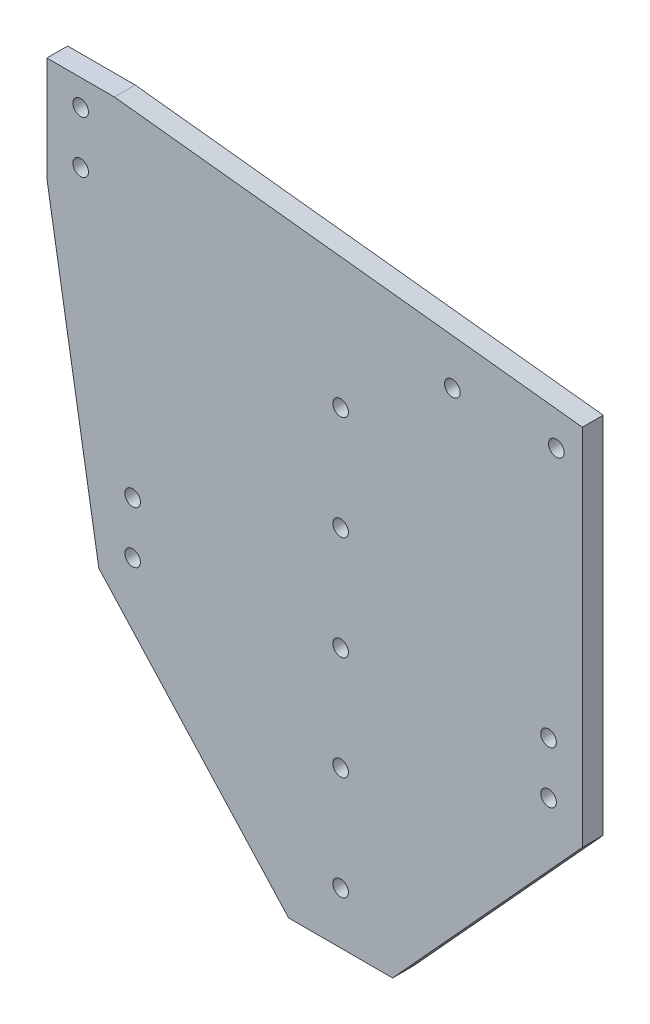
ISO-10303-21;
HEADER;
FILE_DESCRIPTION(('STEP AP214'),'2;1');
FILE_NAME('part.step','',(''),(''),'','','');
FILE_SCHEMA(('AUTOMOTIVE_DESIGN { 1 0 10303 214 1 1 1 1 }'));
ENDSEC;
DATA;
#1=APPLICATION_CONTEXT('core data for automotive mechanical design processes');
#2=APPLICATION_PROTOCOL_DEFINITION('international standard','automotive_design',2000,#1);
#3=PRODUCT_CONTEXT('',#1,'mechanical');
#4=PRODUCT('Part','Part','',(#3));
#5=PRODUCT_RELATED_PRODUCT_CATEGORY('part','',(#4));
#6=PRODUCT_DEFINITION_FORMATION('','',#4);
#7=PRODUCT_DEFINITION_CONTEXT('part definition',#1,'design');
#8=PRODUCT_DEFINITION('design','',#6,#7);
#9=PRODUCT_DEFINITION_SHAPE('','',#8);
#10=(LENGTH_UNIT() NAMED_UNIT(*) SI_UNIT(.MILLI.,.METRE.));
#11=(NAMED_UNIT(*) PLANE_ANGLE_UNIT() SI_UNIT($,.RADIAN.));
#12=(NAMED_UNIT(*) SI_UNIT($,.STERADIAN.) SOLID_ANGLE_UNIT());
#13=UNCERTAINTY_MEASURE_WITH_UNIT(LENGTH_MEASURE(1.E-05),#10,'distance_accuracy_value','');
#14=(GEOMETRIC_REPRESENTATION_CONTEXT(3) GLOBAL_UNCERTAINTY_ASSIGNED_CONTEXT((#13)) GLOBAL_UNIT_ASSIGNED_CONTEXT((#10,
#11,#12)) REPRESENTATION_CONTEXT('',''));
#15=CARTESIAN_POINT('',(0.,0.,0.));
#16=DIRECTION('',(0.,0.,1.));
#17=DIRECTION('',(1.,0.,0.));
#18=AXIS2_PLACEMENT_3D('',#15,#16,#17);
#19=CARTESIAN_POINT('',(0.,0.,4.));
#20=DIRECTION('',(0.,0.,-1.));
#21=DIRECTION('',(-1.,0.,0.));
#22=AXIS2_PLACEMENT_3D('',#19,#20,#21);
#23=PLANE('',#22);
#24=DIRECTION('',(0.674050394139193,0.738685363440212,0.));
#25=VECTOR('',#24,1.);
#26=CARTESIAN_POINT('',(-36.5,-40.,4.));
#27=LINE('',#26,#25);
#28=CARTESIAN_POINT('',(-36.5,-40.,4.));
#29=VERTEX_POINT('',#28);
#30=CARTESIAN_POINT('',(0.,0.,4.));
#31=VERTEX_POINT('',#30);
#32=EDGE_CURVE('E153',#29,#31,#27,.T.);
#33=ORIENTED_EDGE('',*,*,#32,.T.);
#34=DIRECTION('',(0.,1.,0.));
#35=VECTOR('',#34,1.);
#36=CARTESIAN_POINT('',(0.,0.,4.));
#37=LINE('',#36,#35);
#38=CARTESIAN_POINT('',(0.,70.,4.));
#39=VERTEX_POINT('',#38);
#40=EDGE_CURVE('E101',#31,#39,#37,.T.);
#41=ORIENTED_EDGE('',*,*,#40,.T.);
#42=DIRECTION('',(-0.993883734673619,0.110431526074847,0.));
#43=VECTOR('',#42,1.);
#44=CARTESIAN_POINT('',(-90.,80.,4.));
#45=LINE('',#44,#43);
#46=CARTESIAN_POINT('',(-90.,80.,4.));
#47=VERTEX_POINT('',#46);
#48=EDGE_CURVE('E169',#39,#47,#45,.T.);
#49=ORIENTED_EDGE('',*,*,#48,.T.);
#50=DIRECTION('',(-1.,0.,0.));
#51=VECTOR('',#50,1.);
#52=CARTESIAN_POINT('',(-103.,80.,4.));
#53=LINE('',#52,#51);
#54=CARTESIAN_POINT('',(-103.,80.,4.));
#55=VERTEX_POINT('',#54);
#56=EDGE_CURVE('E182',#47,#55,#53,.T.);
#57=ORIENTED_EDGE('',*,*,#56,.T.);
#58=DIRECTION('',(0.,-1.,0.));
#59=VECTOR('',#58,1.);
#60=CARTESIAN_POINT('',(-103.,80.,4.));
#61=LINE('',#60,#59);
#62=CARTESIAN_POINT('',(-103.,60.,4.));
#63=VERTEX_POINT('',#62);
#64=EDGE_CURVE('E119',#55,#63,#61,.T.);
#65=ORIENTED_EDGE('',*,*,#64,.T.);
#66=DIRECTION('',(0.164398987305357,-0.986393923832144,0.));
#67=VECTOR('',#66,1.);
#68=CARTESIAN_POINT('',(-103.,60.,4.));
#69=LINE('',#68,#67);
#70=CARTESIAN_POINT('',(-93.,0.,4.));
#71=VERTEX_POINT('',#70);
#72=EDGE_CURVE('E111',#63,#71,#69,.T.);
#73=ORIENTED_EDGE('',*,*,#72,.T.);
#74=DIRECTION('',(0.674050394139193,-0.738685363440212,0.));
#75=VECTOR('',#74,1.);
#76=CARTESIAN_POINT('',(-93.,0.,4.));
#77=LINE('',#76,#75);
#78=CARTESIAN_POINT('',(-56.5,-40.,4.));
#79=VERTEX_POINT('',#78);
#80=EDGE_CURVE('E116',#71,#79,#77,.T.);
#81=ORIENTED_EDGE('',*,*,#80,.T.);
#82=DIRECTION('',(1.,0.,0.));
#83=VECTOR('',#82,1.);
#84=CARTESIAN_POINT('',(-56.5,-40.,4.));
#85=LINE('',#84,#83);
#86=EDGE_CURVE('E59',#79,#29,#85,.T.);
#87=ORIENTED_EDGE('',*,*,#86,.T.);
#88=EDGE_LOOP('',(#33,#41,#49,#57,#65,#73,#81,#87));
#89=FACE_BOUND('',#88,.T.);
#90=CARTESIAN_POINT('',(-86.5,15.,4.));
#91=DIRECTION('',(0.,0.,1.));
#92=DIRECTION('',(1.,0.,0.));
#93=AXIS2_PLACEMENT_3D('',#90,#91,#92);
#94=CIRCLE('',#93,1.5);
#95=CARTESIAN_POINT('',(-85.,15.,4.));
#96=VERTEX_POINT('',#95);
#97=EDGE_CURVE('E142',#96,#96,#94,.T.);
#98=ORIENTED_EDGE('',*,*,#97,.F.);
#99=EDGE_LOOP('',(#98));
#100=FACE_BOUND('',#99,.T.);
#101=CARTESIAN_POINT('',(-86.5,5.,4.));
#102=DIRECTION('',(0.,0.,1.));
#103=DIRECTION('',(-1.,0.,0.));
#104=AXIS2_PLACEMENT_3D('',#101,#102,#103);
#105=CIRCLE('',#104,1.5);
#106=CARTESIAN_POINT('',(-88.,5.,4.));
#107=VERTEX_POINT('',#106);
#108=EDGE_CURVE('E189',#107,#107,#105,.T.);
#109=ORIENTED_EDGE('',*,*,#108,.F.);
#110=EDGE_LOOP('',(#109));
#111=FACE_BOUND('',#110,.T.);
#112=CARTESIAN_POINT('',(-6.5,5.,4.));
#113=DIRECTION('',(0.,0.,1.));
#114=DIRECTION('',(1.,0.,0.));
#115=AXIS2_PLACEMENT_3D('',#112,#113,#114);
#116=CIRCLE('',#115,1.5);
#117=CARTESIAN_POINT('',(-5.,5.,4.));
#118=VERTEX_POINT('',#117);
#119=EDGE_CURVE('E198',#118,#118,#116,.T.);
#120=ORIENTED_EDGE('',*,*,#119,.F.);
#121=EDGE_LOOP('',(#120));
#122=FACE_BOUND('',#121,.T.);
#123=CARTESIAN_POINT('',(-6.50000000000001,15.,4.));
#124=DIRECTION('',(0.,0.,1.));
#125=DIRECTION('',(-1.,0.,0.));
#126=AXIS2_PLACEMENT_3D('',#123,#124,#125);
#127=CIRCLE('',#126,1.5);
#128=CARTESIAN_POINT('',(-8.00000000000001,15.,4.));
#129=VERTEX_POINT('',#128);
#130=EDGE_CURVE('E205',#129,#129,#127,.T.);
#131=ORIENTED_EDGE('',*,*,#130,.F.);
#132=EDGE_LOOP('',(#131));
#133=FACE_BOUND('',#132,.T.);
#134=CARTESIAN_POINT('',(-96.5,75.,4.));
#135=DIRECTION('',(0.,0.,1.));
#136=DIRECTION('',(1.,0.,0.));
#137=AXIS2_PLACEMENT_3D('',#134,#135,#136);
#138=CIRCLE('',#137,1.5);
#139=CARTESIAN_POINT('',(-95.,75.,4.));
#140=VERTEX_POINT('',#139);
#141=EDGE_CURVE('E208',#140,#140,#138,.T.);
#142=ORIENTED_EDGE('',*,*,#141,.F.);
#143=EDGE_LOOP('',(#142));
#144=FACE_BOUND('',#143,.T.);
#145=CARTESIAN_POINT('',(-96.4999999999999,65.,4.));
#146=DIRECTION('',(0.,0.,1.));
#147=DIRECTION('',(1.,0.,0.));
#148=AXIS2_PLACEMENT_3D('',#145,#146,#147);
#149=CIRCLE('',#148,1.5);
#150=CARTESIAN_POINT('',(-94.9999999999999,65.,4.));
#151=VERTEX_POINT('',#150);
#152=EDGE_CURVE('E212',#151,#151,#149,.T.);
#153=ORIENTED_EDGE('',*,*,#152,.F.);
#154=EDGE_LOOP('',(#153));
#155=FACE_BOUND('',#154,.T.);
#156=CARTESIAN_POINT('',(-46.5,9.99999999999999,4.));
#157=DIRECTION('',(0.,0.,1.));
#158=DIRECTION('',(1.,0.,0.));
#159=AXIS2_PLACEMENT_3D('',#156,#157,#158);
#160=CIRCLE('',#159,1.5);
#161=CARTESIAN_POINT('',(-45.,9.99999999999999,4.));
#162=VERTEX_POINT('',#161);
#163=EDGE_CURVE('E219',#162,#162,#160,.T.);
#164=ORIENTED_EDGE('',*,*,#163,.F.);
#165=EDGE_LOOP('',(#164));
#166=FACE_BOUND('',#165,.T.);
#167=CARTESIAN_POINT('',(-46.5000000000001,30.,4.));
#168=DIRECTION('',(0.,0.,1.));
#169=DIRECTION('',(1.,0.,0.));
#170=AXIS2_PLACEMENT_3D('',#167,#168,#169);
#171=CIRCLE('',#170,1.5);
#172=CARTESIAN_POINT('',(-45.0000000000001,30.,4.));
#173=VERTEX_POINT('',#172);
#174=EDGE_CURVE('E228',#173,#173,#171,.T.);
#175=ORIENTED_EDGE('',*,*,#174,.F.);
#176=EDGE_LOOP('',(#175));
#177=FACE_BOUND('',#176,.T.);
#178=CARTESIAN_POINT('',(-46.5000000000001,50.,4.));
#179=DIRECTION('',(0.,0.,1.));
#180=DIRECTION('',(1.,0.,0.));
#181=AXIS2_PLACEMENT_3D('',#178,#179,#180);
#182=CIRCLE('',#181,1.5);
#183=CARTESIAN_POINT('',(-45.0000000000001,50.,4.));
#184=VERTEX_POINT('',#183);
#185=EDGE_CURVE('E235',#184,#184,#182,.T.);
#186=ORIENTED_EDGE('',*,*,#185,.F.);
#187=EDGE_LOOP('',(#186));
#188=FACE_BOUND('',#187,.T.);
#189=CARTESIAN_POINT('',(-46.4999999999998,-10.,4.));
#190=DIRECTION('',(0.,0.,1.));
#191=DIRECTION('',(1.,0.,0.));
#192=AXIS2_PLACEMENT_3D('',#189,#190,#191);
#193=CIRCLE('',#192,1.5);
#194=CARTESIAN_POINT('',(-44.9999999999998,-10.,4.));
#195=VERTEX_POINT('',#194);
#196=EDGE_CURVE('E236',#195,#195,#193,.T.);
#197=ORIENTED_EDGE('',*,*,#196,.F.);
#198=EDGE_LOOP('',(#197));
#199=FACE_BOUND('',#198,.T.);
#200=CARTESIAN_POINT('',(-46.4999999999996,-30.,4.));
#201=DIRECTION('',(0.,0.,1.));
#202=DIRECTION('',(1.,0.,0.));
#203=AXIS2_PLACEMENT_3D('',#200,#201,#202);
#204=CIRCLE('',#203,1.5);
#205=CARTESIAN_POINT('',(-44.9999999999996,-30.,4.));
#206=VERTEX_POINT('',#205);
#207=EDGE_CURVE('E242',#206,#206,#204,.T.);
#208=ORIENTED_EDGE('',*,*,#207,.F.);
#209=EDGE_LOOP('',(#208));
#210=FACE_BOUND('',#209,.T.);
#211=CARTESIAN_POINT('',(-5.,64.,4.));
#212=DIRECTION('',(0.,0.,1.));
#213=DIRECTION('',(1.,0.,0.));
#214=AXIS2_PLACEMENT_3D('',#211,#212,#213);
#215=CIRCLE('',#214,1.5);
#216=CARTESIAN_POINT('',(-3.5,64.,4.));
#217=VERTEX_POINT('',#216);
#218=EDGE_CURVE('E249',#217,#217,#215,.T.);
#219=ORIENTED_EDGE('',*,*,#218,.F.);
#220=EDGE_LOOP('',(#219));
#221=FACE_BOUND('',#220,.T.);
#222=CARTESIAN_POINT('',(-25.,64.,4.));
#223=DIRECTION('',(0.,0.,1.));
#224=DIRECTION('',(1.,0.,0.));
#225=AXIS2_PLACEMENT_3D('',#222,#223,#224);
#226=CIRCLE('',#225,1.5);
#227=CARTESIAN_POINT('',(-23.5,64.,4.));
#228=VERTEX_POINT('',#227);
#229=EDGE_CURVE('E258',#228,#228,#226,.T.);
#230=ORIENTED_EDGE('',*,*,#229,.F.);
#231=EDGE_LOOP('',(#230));
#232=FACE_BOUND('',#231,.T.);
#233=ADVANCED_FACE('F41',(#89,#100,#111,#122,#133,#144,#155,#166,#177,#188,#199,#210,#221,#232),
#23,.F.);
#234=CARTESIAN_POINT('',(0.,0.,0.));
#235=DIRECTION('',(0.,0.,-1.));
#236=DIRECTION('',(-1.,0.,0.));
#237=AXIS2_PLACEMENT_3D('',#234,#235,#236);
#238=PLANE('',#237);
#239=CARTESIAN_POINT('',(-5.,64.,0.));
#240=DIRECTION('',(0.,0.,1.));
#241=DIRECTION('',(1.,0.,0.));
#242=AXIS2_PLACEMENT_3D('',#239,#240,#241);
#243=CIRCLE('',#242,1.5);
#244=CARTESIAN_POINT('',(-3.5,64.,0.));
#245=VERTEX_POINT('',#244);
#246=EDGE_CURVE('E251',#245,#245,#243,.T.);
#247=ORIENTED_EDGE('',*,*,#246,.T.);
#248=EDGE_LOOP('',(#247));
#249=FACE_BOUND('',#248,.T.);
#250=CARTESIAN_POINT('',(-46.4999999999998,-10.,0.));
#251=DIRECTION('',(0.,0.,1.));
#252=DIRECTION('',(1.,0.,0.));
#253=AXIS2_PLACEMENT_3D('',#250,#251,#252);
#254=CIRCLE('',#253,1.5);
#255=CARTESIAN_POINT('',(-44.9999999999998,-10.,0.));
#256=VERTEX_POINT('',#255);
#257=EDGE_CURVE('E243',#256,#256,#254,.T.);
#258=ORIENTED_EDGE('',*,*,#257,.T.);
#259=EDGE_LOOP('',(#258));
#260=FACE_BOUND('',#259,.T.);
#261=CARTESIAN_POINT('',(-46.5000000000001,30.,0.));
#262=DIRECTION('',(0.,0.,1.));
#263=DIRECTION('',(1.,0.,0.));
#264=AXIS2_PLACEMENT_3D('',#261,#262,#263);
#265=CIRCLE('',#264,1.5);
#266=CARTESIAN_POINT('',(-45.0000000000001,30.,0.));
#267=VERTEX_POINT('',#266);
#268=EDGE_CURVE('E227',#267,#267,#265,.T.);
#269=ORIENTED_EDGE('',*,*,#268,.T.);
#270=EDGE_LOOP('',(#269));
#271=FACE_BOUND('',#270,.T.);
#272=CARTESIAN_POINT('',(-96.4999999999999,65.,0.));
#273=DIRECTION('',(0.,0.,1.));
#274=DIRECTION('',(1.,0.,0.));
#275=AXIS2_PLACEMENT_3D('',#272,#273,#274);
#276=CIRCLE('',#275,1.5);
#277=CARTESIAN_POINT('',(-94.9999999999999,65.,0.));
#278=VERTEX_POINT('',#277);
#279=EDGE_CURVE('E220',#278,#278,#276,.T.);
#280=ORIENTED_EDGE('',*,*,#279,.T.);
#281=EDGE_LOOP('',(#280));
#282=FACE_BOUND('',#281,.T.);
#283=CARTESIAN_POINT('',(-6.50000000000001,15.,0.));
#284=DIRECTION('',(0.,0.,1.));
#285=DIRECTION('',(-1.,0.,0.));
#286=AXIS2_PLACEMENT_3D('',#283,#284,#285);
#287=CIRCLE('',#286,1.5);
#288=CARTESIAN_POINT('',(-8.00000000000001,15.,0.));
#289=VERTEX_POINT('',#288);
#290=EDGE_CURVE('E202',#289,#289,#287,.T.);
#291=ORIENTED_EDGE('',*,*,#290,.T.);
#292=EDGE_LOOP('',(#291));
#293=FACE_BOUND('',#292,.T.);
#294=CARTESIAN_POINT('',(-86.5,5.,0.));
#295=DIRECTION('',(0.,0.,1.));
#296=DIRECTION('',(-1.,0.,0.));
#297=AXIS2_PLACEMENT_3D('',#294,#295,#296);
#298=CIRCLE('',#297,1.5);
#299=CARTESIAN_POINT('',(-88.,5.,0.));
#300=VERTEX_POINT('',#299);
#301=EDGE_CURVE('E191',#300,#300,#298,.T.);
#302=ORIENTED_EDGE('',*,*,#301,.T.);
#303=EDGE_LOOP('',(#302));
#304=FACE_BOUND('',#303,.T.);
#305=DIRECTION('',(0.674050394139193,0.738685363440212,0.));
#306=VECTOR('',#305,1.);
#307=CARTESIAN_POINT('',(-36.5,-40.,0.));
#308=LINE('',#307,#306);
#309=CARTESIAN_POINT('',(-36.5,-40.,0.));
#310=VERTEX_POINT('',#309);
#311=CARTESIAN_POINT('',(0.,0.,0.));
#312=VERTEX_POINT('',#311);
#313=EDGE_CURVE('E136',#310,#312,#308,.T.);
#314=ORIENTED_EDGE('',*,*,#313,.F.);
#315=DIRECTION('',(1.,0.,0.));
#316=VECTOR('',#315,1.);
#317=CARTESIAN_POINT('',(-56.5,-40.,0.));
#318=LINE('',#317,#316);
#319=CARTESIAN_POINT('',(-56.5,-40.,0.));
#320=VERTEX_POINT('',#319);
#321=EDGE_CURVE('E91',#320,#310,#318,.T.);
#322=ORIENTED_EDGE('',*,*,#321,.F.);
#323=DIRECTION('',(0.674050394139193,-0.738685363440212,0.));
#324=VECTOR('',#323,1.);
#325=CARTESIAN_POINT('',(-93.,0.,0.));
#326=LINE('',#325,#324);
#327=CARTESIAN_POINT('',(-93.,0.,0.));
#328=VERTEX_POINT('',#327);
#329=EDGE_CURVE('E87',#328,#320,#326,.T.);
#330=ORIENTED_EDGE('',*,*,#329,.F.);
#331=DIRECTION('',(0.164398987305357,-0.986393923832144,0.));
#332=VECTOR('',#331,1.);
#333=CARTESIAN_POINT('',(-103.,60.,0.));
#334=LINE('',#333,#332);
#335=CARTESIAN_POINT('',(-103.,60.,0.));
#336=VERTEX_POINT('',#335);
#337=EDGE_CURVE('E126',#336,#328,#334,.T.);
#338=ORIENTED_EDGE('',*,*,#337,.F.);
#339=DIRECTION('',(0.,-1.,0.));
#340=VECTOR('',#339,1.);
#341=CARTESIAN_POINT('',(-103.,80.,0.));
#342=LINE('',#341,#340);
#343=CARTESIAN_POINT('',(-103.,80.,0.));
#344=VERTEX_POINT('',#343);
#345=EDGE_CURVE('E146',#344,#336,#342,.T.);
#346=ORIENTED_EDGE('',*,*,#345,.F.);
#347=DIRECTION('',(-1.,0.,0.));
#348=VECTOR('',#347,1.);
#349=CARTESIAN_POINT('',(-103.,80.,0.));
#350=LINE('',#349,#348);
#351=CARTESIAN_POINT('',(-90.,80.,0.));
#352=VERTEX_POINT('',#351);
#353=EDGE_CURVE('E148',#352,#344,#350,.T.);
#354=ORIENTED_EDGE('',*,*,#353,.F.);
#355=DIRECTION('',(-0.993883734673619,0.110431526074847,0.));
#356=VECTOR('',#355,1.);
#357=CARTESIAN_POINT('',(-90.,80.,0.));
#358=LINE('',#357,#356);
#359=CARTESIAN_POINT('',(0.,70.,0.));
#360=VERTEX_POINT('',#359);
#361=EDGE_CURVE('E145',#360,#352,#358,.T.);
#362=ORIENTED_EDGE('',*,*,#361,.F.);
#363=DIRECTION('',(0.,1.,0.));
#364=VECTOR('',#363,1.);
#365=CARTESIAN_POINT('',(0.,0.,0.));
#366=LINE('',#365,#364);
#367=EDGE_CURVE('E143',#312,#360,#366,.T.);
#368=ORIENTED_EDGE('',*,*,#367,.F.);
#369=EDGE_LOOP('',(#314,#322,#330,#338,#346,#354,#362,#368));
#370=FACE_BOUND('',#369,.T.);
#371=CARTESIAN_POINT('',(-86.5,15.,0.));
#372=DIRECTION('',(0.,0.,1.));
#373=DIRECTION('',(1.,0.,0.));
#374=AXIS2_PLACEMENT_3D('',#371,#372,#373);
#375=CIRCLE('',#374,1.5);
#376=CARTESIAN_POINT('',(-85.,15.,0.));
#377=VERTEX_POINT('',#376);
#378=EDGE_CURVE('E190',#377,#377,#375,.T.);
#379=ORIENTED_EDGE('',*,*,#378,.T.);
#380=EDGE_LOOP('',(#379));
#381=FACE_BOUND('',#380,.T.);
#382=CARTESIAN_POINT('',(-6.5,5.,0.));
#383=DIRECTION('',(0.,0.,1.));
#384=DIRECTION('',(1.,0.,0.));
#385=AXIS2_PLACEMENT_3D('',#382,#383,#384);
#386=CIRCLE('',#385,1.5);
#387=CARTESIAN_POINT('',(-5.,5.,0.));
#388=VERTEX_POINT('',#387);
#389=EDGE_CURVE('E200',#388,#388,#386,.T.);
#390=ORIENTED_EDGE('',*,*,#389,.T.);
#391=EDGE_LOOP('',(#390));
#392=FACE_BOUND('',#391,.T.);
#393=CARTESIAN_POINT('',(-96.5,75.,0.));
#394=DIRECTION('',(0.,0.,1.));
#395=DIRECTION('',(1.,0.,0.));
#396=AXIS2_PLACEMENT_3D('',#393,#394,#395);
#397=CIRCLE('',#396,1.5);
#398=CARTESIAN_POINT('',(-95.,75.,0.));
#399=VERTEX_POINT('',#398);
#400=EDGE_CURVE('E211',#399,#399,#397,.T.);
#401=ORIENTED_EDGE('',*,*,#400,.T.);
#402=EDGE_LOOP('',(#401));
#403=FACE_BOUND('',#402,.T.);
#404=CARTESIAN_POINT('',(-46.5,9.99999999999999,0.));
#405=DIRECTION('',(0.,0.,1.));
#406=DIRECTION('',(1.,0.,0.));
#407=AXIS2_PLACEMENT_3D('',#404,#405,#406);
#408=CIRCLE('',#407,1.5);
#409=CARTESIAN_POINT('',(-45.,9.99999999999999,0.));
#410=VERTEX_POINT('',#409);
#411=EDGE_CURVE('E224',#410,#410,#408,.T.);
#412=ORIENTED_EDGE('',*,*,#411,.T.);
#413=EDGE_LOOP('',(#412));
#414=FACE_BOUND('',#413,.T.);
#415=CARTESIAN_POINT('',(-46.5000000000001,50.,0.));
#416=DIRECTION('',(0.,0.,1.));
#417=DIRECTION('',(1.,0.,0.));
#418=AXIS2_PLACEMENT_3D('',#415,#416,#417);
#419=CIRCLE('',#418,1.5);
#420=CARTESIAN_POINT('',(-45.0000000000001,50.,0.));
#421=VERTEX_POINT('',#420);
#422=EDGE_CURVE('E234',#421,#421,#419,.T.);
#423=ORIENTED_EDGE('',*,*,#422,.T.);
#424=EDGE_LOOP('',(#423));
#425=FACE_BOUND('',#424,.T.);
#426=CARTESIAN_POINT('',(-46.4999999999996,-30.,0.));
#427=DIRECTION('',(0.,0.,1.));
#428=DIRECTION('',(1.,0.,0.));
#429=AXIS2_PLACEMENT_3D('',#426,#427,#428);
#430=CIRCLE('',#429,1.5);
#431=CARTESIAN_POINT('',(-44.9999999999996,-30.,0.));
#432=VERTEX_POINT('',#431);
#433=EDGE_CURVE('E250',#432,#432,#430,.T.);
#434=ORIENTED_EDGE('',*,*,#433,.T.);
#435=EDGE_LOOP('',(#434));
#436=FACE_BOUND('',#435,.T.);
#437=CARTESIAN_POINT('',(-25.,64.,0.));
#438=DIRECTION('',(0.,0.,1.));
#439=DIRECTION('',(1.,0.,0.));
#440=AXIS2_PLACEMENT_3D('',#437,#438,#439);
#441=CIRCLE('',#440,1.5);
#442=CARTESIAN_POINT('',(-23.5,64.,0.));
#443=VERTEX_POINT('',#442);
#444=EDGE_CURVE('E259',#443,#443,#441,.T.);
#445=ORIENTED_EDGE('',*,*,#444,.T.);
#446=EDGE_LOOP('',(#445));
#447=FACE_BOUND('',#446,.T.);
#448=ADVANCED_FACE('F175',(#249,#260,#271,#282,#293,#304,#370,#381,#392,#403,#414,#425,#436,
#447),#238,.T.);
#449=CARTESIAN_POINT('',(-36.5,-40.,4.));
#450=DIRECTION('',(-0.738685363440212,0.674050394139193,0.));
#451=DIRECTION('',(-0.674050394139193,-0.738685363440212,0.));
#452=AXIS2_PLACEMENT_3D('',#449,#450,#451);
#453=PLANE('',#452);
#454=ORIENTED_EDGE('',*,*,#313,.T.);
#455=DIRECTION('',(0.,0.,-1.));
#456=VECTOR('',#455,1.);
#457=CARTESIAN_POINT('',(0.,0.,4.));
#458=LINE('',#457,#456);
#459=EDGE_CURVE('E11',#31,#312,#458,.T.);
#460=ORIENTED_EDGE('',*,*,#459,.F.);
#461=ORIENTED_EDGE('',*,*,#32,.F.);
#462=DIRECTION('',(0.,0.,-1.));
#463=VECTOR('',#462,1.);
#464=CARTESIAN_POINT('',(-36.5,-40.,4.));
#465=LINE('',#464,#463);
#466=EDGE_CURVE('E132',#29,#310,#465,.T.);
#467=ORIENTED_EDGE('',*,*,#466,.T.);
#468=EDGE_LOOP('',(#454,#460,#461,#467));
#469=FACE_BOUND('',#468,.T.);
#470=ADVANCED_FACE('F43',(#469),#453,.F.);
#471=CARTESIAN_POINT('',(0.,0.,4.));
#472=DIRECTION('',(-1.,0.,0.));
#473=DIRECTION('',(0.,0.,1.));
#474=AXIS2_PLACEMENT_3D('',#471,#472,#473);
#475=PLANE('',#474);
#476=ORIENTED_EDGE('',*,*,#367,.T.);
#477=DIRECTION('',(0.,0.,-1.));
#478=VECTOR('',#477,1.);
#479=CARTESIAN_POINT('',(0.,70.,4.));
#480=LINE('',#479,#478);
#481=EDGE_CURVE('E49',#39,#360,#480,.T.);
#482=ORIENTED_EDGE('',*,*,#481,.F.);
#483=ORIENTED_EDGE('',*,*,#40,.F.);
#484=ORIENTED_EDGE('',*,*,#459,.T.);
#485=EDGE_LOOP('',(#476,#482,#483,#484));
#486=FACE_BOUND('',#485,.T.);
#487=ADVANCED_FACE('F292',(#486),#475,.F.);
#488=CARTESIAN_POINT('',(-90.,80.,4.));
#489=DIRECTION('',(-0.110431526074846,-0.993883734673619,0.));
#490=DIRECTION('',(0.993883734673619,-0.110431526074846,0.));
#491=AXIS2_PLACEMENT_3D('',#488,#489,#490);
#492=PLANE('',#491);
#493=ORIENTED_EDGE('',*,*,#361,.T.);
#494=DIRECTION('',(0.,0.,-1.));
#495=VECTOR('',#494,1.);
#496=CARTESIAN_POINT('',(-90.,80.,4.));
#497=LINE('',#496,#495);
#498=EDGE_CURVE('E159',#47,#352,#497,.T.);
#499=ORIENTED_EDGE('',*,*,#498,.F.);
#500=ORIENTED_EDGE('',*,*,#48,.F.);
#501=ORIENTED_EDGE('',*,*,#481,.T.);
#502=EDGE_LOOP('',(#493,#499,#500,#501));
#503=FACE_BOUND('',#502,.T.);
#504=ADVANCED_FACE('F167',(#503),#492,.F.);
#505=CARTESIAN_POINT('',(-103.,80.,4.));
#506=DIRECTION('',(0.,-1.,0.));
#507=DIRECTION('',(0.,0.,-1.));
#508=AXIS2_PLACEMENT_3D('',#505,#506,#507);
#509=PLANE('',#508);
#510=ORIENTED_EDGE('',*,*,#353,.T.);
#511=DIRECTION('',(0.,0.,-1.));
#512=VECTOR('',#511,1.);
#513=CARTESIAN_POINT('',(-103.,80.,4.));
#514=LINE('',#513,#512);
#515=EDGE_CURVE('E160',#55,#344,#514,.T.);
#516=ORIENTED_EDGE('',*,*,#515,.F.);
#517=ORIENTED_EDGE('',*,*,#56,.F.);
#518=ORIENTED_EDGE('',*,*,#498,.T.);
#519=EDGE_LOOP('',(#510,#516,#517,#518));
#520=FACE_BOUND('',#519,.T.);
#521=ADVANCED_FACE('F180',(#520),#509,.F.);
#522=CARTESIAN_POINT('',(-103.,80.,4.));
#523=DIRECTION('',(1.,0.,0.));
#524=DIRECTION('',(0.,0.,-1.));
#525=AXIS2_PLACEMENT_3D('',#522,#523,#524);
#526=PLANE('',#525);
#527=ORIENTED_EDGE('',*,*,#345,.T.);
#528=DIRECTION('',(0.,0.,-1.));
#529=VECTOR('',#528,1.);
#530=CARTESIAN_POINT('',(-103.,60.,4.));
#531=LINE('',#530,#529);
#532=EDGE_CURVE('E129',#63,#336,#531,.T.);
#533=ORIENTED_EDGE('',*,*,#532,.F.);
#534=ORIENTED_EDGE('',*,*,#64,.F.);
#535=ORIENTED_EDGE('',*,*,#515,.T.);
#536=EDGE_LOOP('',(#527,#533,#534,#535));
#537=FACE_BOUND('',#536,.T.);
#538=ADVANCED_FACE('F179',(#537),#526,.F.);
#539=CARTESIAN_POINT('',(-103.,60.,4.));
#540=DIRECTION('',(0.986393923832144,0.164398987305357,0.));
#541=DIRECTION('',(-0.164398987305357,0.986393923832144,0.));
#542=AXIS2_PLACEMENT_3D('',#539,#540,#541);
#543=PLANE('',#542);
#544=ORIENTED_EDGE('',*,*,#337,.T.);
#545=DIRECTION('',(0.,0.,-1.));
#546=VECTOR('',#545,1.);
#547=CARTESIAN_POINT('',(-93.,0.,4.));
#548=LINE('',#547,#546);
#549=EDGE_CURVE('E124',#71,#328,#548,.T.);
#550=ORIENTED_EDGE('',*,*,#549,.F.);
#551=ORIENTED_EDGE('',*,*,#72,.F.);
#552=ORIENTED_EDGE('',*,*,#532,.T.);
#553=EDGE_LOOP('',(#544,#550,#551,#552));
#554=FACE_BOUND('',#553,.T.);
#555=ADVANCED_FACE('F127',(#554),#543,.F.);
#556=CARTESIAN_POINT('',(-93.,0.,4.));
#557=DIRECTION('',(0.738685363440212,0.674050394139193,0.));
#558=DIRECTION('',(-0.674050394139193,0.738685363440212,0.));
#559=AXIS2_PLACEMENT_3D('',#556,#557,#558);
#560=PLANE('',#559);
#561=ORIENTED_EDGE('',*,*,#329,.T.);
#562=DIRECTION('',(0.,0.,-1.));
#563=VECTOR('',#562,1.);
#564=CARTESIAN_POINT('',(-56.5,-40.,4.));
#565=LINE('',#564,#563);
#566=EDGE_CURVE('E128',#79,#320,#565,.T.);
#567=ORIENTED_EDGE('',*,*,#566,.F.);
#568=ORIENTED_EDGE('',*,*,#80,.F.);
#569=ORIENTED_EDGE('',*,*,#549,.T.);
#570=EDGE_LOOP('',(#561,#567,#568,#569));
#571=FACE_BOUND('',#570,.T.);
#572=ADVANCED_FACE('F135',(#571),#560,.F.);
#573=CARTESIAN_POINT('',(-56.5,-40.,4.));
#574=DIRECTION('',(0.,1.,0.));
#575=DIRECTION('',(-1.,0.,0.));
#576=AXIS2_PLACEMENT_3D('',#573,#574,#575);
#577=PLANE('',#576);
#578=ORIENTED_EDGE('',*,*,#321,.T.);
#579=ORIENTED_EDGE('',*,*,#466,.F.);
#580=ORIENTED_EDGE('',*,*,#86,.F.);
#581=ORIENTED_EDGE('',*,*,#566,.T.);
#582=EDGE_LOOP('',(#578,#579,#580,#581));
#583=FACE_BOUND('',#582,.T.);
#584=ADVANCED_FACE('F276',(#583),#577,.F.);
#585=CARTESIAN_POINT('',(-86.5,15.,4.));
#586=DIRECTION('',(0.,0.,-1.));
#587=DIRECTION('',(-1.,0.,0.));
#588=AXIS2_PLACEMENT_3D('',#585,#586,#587);
#589=CYLINDRICAL_SURFACE('',#588,1.5);
#590=ORIENTED_EDGE('',*,*,#97,.T.);
#591=EDGE_LOOP('',(#590));
#592=FACE_BOUND('',#591,.T.);
#593=ORIENTED_EDGE('',*,*,#378,.F.);
#594=EDGE_LOOP('',(#593));
#595=FACE_BOUND('',#594,.T.);
#596=ADVANCED_FACE('F277',(#592,#595),#589,.F.);
#597=CARTESIAN_POINT('',(-86.5,5.,4.));
#598=DIRECTION('',(0.,0.,-1.));
#599=DIRECTION('',(-1.,0.,0.));
#600=AXIS2_PLACEMENT_3D('',#597,#598,#599);
#601=CYLINDRICAL_SURFACE('',#600,1.5);
#602=ORIENTED_EDGE('',*,*,#108,.T.);
#603=EDGE_LOOP('',(#602));
#604=FACE_BOUND('',#603,.T.);
#605=ORIENTED_EDGE('',*,*,#301,.F.);
#606=EDGE_LOOP('',(#605));
#607=FACE_BOUND('',#606,.T.);
#608=ADVANCED_FACE('F352',(#604,#607),#601,.F.);
#609=CARTESIAN_POINT('',(-6.5,5.,4.));
#610=DIRECTION('',(0.,0.,-1.));
#611=DIRECTION('',(-1.,0.,0.));
#612=AXIS2_PLACEMENT_3D('',#609,#610,#611);
#613=CYLINDRICAL_SURFACE('',#612,1.5);
#614=ORIENTED_EDGE('',*,*,#119,.T.);
#615=EDGE_LOOP('',(#614));
#616=FACE_BOUND('',#615,.T.);
#617=ORIENTED_EDGE('',*,*,#389,.F.);
#618=EDGE_LOOP('',(#617));
#619=FACE_BOUND('',#618,.T.);
#620=ADVANCED_FACE('F362',(#616,#619),#613,.F.);
#621=CARTESIAN_POINT('',(-6.50000000000001,15.,4.));
#622=DIRECTION('',(0.,0.,-1.));
#623=DIRECTION('',(-1.,0.,0.));
#624=AXIS2_PLACEMENT_3D('',#621,#622,#623);
#625=CYLINDRICAL_SURFACE('',#624,1.5);
#626=ORIENTED_EDGE('',*,*,#130,.T.);
#627=EDGE_LOOP('',(#626));
#628=FACE_BOUND('',#627,.T.);
#629=ORIENTED_EDGE('',*,*,#290,.F.);
#630=EDGE_LOOP('',(#629));
#631=FACE_BOUND('',#630,.T.);
#632=ADVANCED_FACE('F367',(#628,#631),#625,.F.);
#633=CARTESIAN_POINT('',(-96.5,75.,4.));
#634=DIRECTION('',(0.,0.,-1.));
#635=DIRECTION('',(-1.,0.,0.));
#636=AXIS2_PLACEMENT_3D('',#633,#634,#635);
#637=CYLINDRICAL_SURFACE('',#636,1.5);
#638=ORIENTED_EDGE('',*,*,#141,.T.);
#639=EDGE_LOOP('',(#638));
#640=FACE_BOUND('',#639,.T.);
#641=ORIENTED_EDGE('',*,*,#400,.F.);
#642=EDGE_LOOP('',(#641));
#643=FACE_BOUND('',#642,.T.);
#644=ADVANCED_FACE('F377',(#640,#643),#637,.F.);
#645=CARTESIAN_POINT('',(-96.4999999999999,65.,4.));
#646=DIRECTION('',(0.,0.,-1.));
#647=DIRECTION('',(-1.,0.,0.));
#648=AXIS2_PLACEMENT_3D('',#645,#646,#647);
#649=CYLINDRICAL_SURFACE('',#648,1.5);
#650=ORIENTED_EDGE('',*,*,#152,.T.);
#651=EDGE_LOOP('',(#650));
#652=FACE_BOUND('',#651,.T.);
#653=ORIENTED_EDGE('',*,*,#279,.F.);
#654=EDGE_LOOP('',(#653));
#655=FACE_BOUND('',#654,.T.);
#656=ADVANCED_FACE('F389',(#652,#655),#649,.F.);
#657=CARTESIAN_POINT('',(-46.5,9.99999999999999,4.));
#658=DIRECTION('',(0.,0.,-1.));
#659=DIRECTION('',(-1.,0.,0.));
#660=AXIS2_PLACEMENT_3D('',#657,#658,#659);
#661=CYLINDRICAL_SURFACE('',#660,1.5);
#662=ORIENTED_EDGE('',*,*,#163,.T.);
#663=EDGE_LOOP('',(#662));
#664=FACE_BOUND('',#663,.T.);
#665=ORIENTED_EDGE('',*,*,#411,.F.);
#666=EDGE_LOOP('',(#665));
#667=FACE_BOUND('',#666,.T.);
#668=ADVANCED_FACE('F400',(#664,#667),#661,.F.);
#669=CARTESIAN_POINT('',(-46.5000000000001,30.,4.));
#670=DIRECTION('',(0.,0.,-1.));
#671=DIRECTION('',(-1.,0.,0.));
#672=AXIS2_PLACEMENT_3D('',#669,#670,#671);
#673=CYLINDRICAL_SURFACE('',#672,1.5);
#674=ORIENTED_EDGE('',*,*,#174,.T.);
#675=EDGE_LOOP('',(#674));
#676=FACE_BOUND('',#675,.T.);
#677=ORIENTED_EDGE('',*,*,#268,.F.);
#678=EDGE_LOOP('',(#677));
#679=FACE_BOUND('',#678,.T.);
#680=ADVANCED_FACE('F408',(#676,#679),#673,.F.);
#681=CARTESIAN_POINT('',(-46.5000000000001,50.,4.));
#682=DIRECTION('',(0.,0.,-1.));
#683=DIRECTION('',(-1.,0.,0.));
#684=AXIS2_PLACEMENT_3D('',#681,#682,#683);
#685=CYLINDRICAL_SURFACE('',#684,1.5);
#686=ORIENTED_EDGE('',*,*,#185,.T.);
#687=EDGE_LOOP('',(#686));
#688=FACE_BOUND('',#687,.T.);
#689=ORIENTED_EDGE('',*,*,#422,.F.);
#690=EDGE_LOOP('',(#689));
#691=FACE_BOUND('',#690,.T.);
#692=ADVANCED_FACE('F414',(#688,#691),#685,.F.);
#693=CARTESIAN_POINT('',(-46.4999999999998,-10.,4.));
#694=DIRECTION('',(0.,0.,-1.));
#695=DIRECTION('',(-1.,0.,0.));
#696=AXIS2_PLACEMENT_3D('',#693,#694,#695);
#697=CYLINDRICAL_SURFACE('',#696,1.5);
#698=ORIENTED_EDGE('',*,*,#196,.T.);
#699=EDGE_LOOP('',(#698));
#700=FACE_BOUND('',#699,.T.);
#701=ORIENTED_EDGE('',*,*,#257,.F.);
#702=EDGE_LOOP('',(#701));
#703=FACE_BOUND('',#702,.T.);
#704=ADVANCED_FACE('F424',(#700,#703),#697,.F.);
#705=CARTESIAN_POINT('',(-46.4999999999996,-30.,4.));
#706=DIRECTION('',(0.,0.,-1.));
#707=DIRECTION('',(-1.,0.,0.));
#708=AXIS2_PLACEMENT_3D('',#705,#706,#707);
#709=CYLINDRICAL_SURFACE('',#708,1.5);
#710=ORIENTED_EDGE('',*,*,#207,.T.);
#711=EDGE_LOOP('',(#710));
#712=FACE_BOUND('',#711,.T.);
#713=ORIENTED_EDGE('',*,*,#433,.F.);
#714=EDGE_LOOP('',(#713));
#715=FACE_BOUND('',#714,.T.);
#716=ADVANCED_FACE('F433',(#712,#715),#709,.F.);
#717=CARTESIAN_POINT('',(-5.,64.,4.));
#718=DIRECTION('',(0.,0.,-1.));
#719=DIRECTION('',(-1.,0.,0.));
#720=AXIS2_PLACEMENT_3D('',#717,#718,#719);
#721=CYLINDRICAL_SURFACE('',#720,1.5);
#722=ORIENTED_EDGE('',*,*,#218,.T.);
#723=EDGE_LOOP('',(#722));
#724=FACE_BOUND('',#723,.T.);
#725=ORIENTED_EDGE('',*,*,#246,.F.);
#726=EDGE_LOOP('',(#725));
#727=FACE_BOUND('',#726,.T.);
#728=ADVANCED_FACE('F445',(#724,#727),#721,.F.);
#729=CARTESIAN_POINT('',(-25.,64.,4.));
#730=DIRECTION('',(0.,0.,-1.));
#731=DIRECTION('',(-1.,0.,0.));
#732=AXIS2_PLACEMENT_3D('',#729,#730,#731);
#733=CYLINDRICAL_SURFACE('',#732,1.5);
#734=ORIENTED_EDGE('',*,*,#229,.T.);
#735=EDGE_LOOP('',(#734));
#736=FACE_BOUND('',#735,.T.);
#737=ORIENTED_EDGE('',*,*,#444,.F.);
#738=EDGE_LOOP('',(#737));
#739=FACE_BOUND('',#738,.T.);
#740=ADVANCED_FACE('F264',(#736,#739),#733,.F.);
#741=CLOSED_SHELL('',(#233,#448,#470,#487,#504,#521,#538,#555,#572,#584,#596,#608,#620,#632,
#644,#656,#668,#680,#692,#704,#716,#728,#740));
#742=MANIFOLD_SOLID_BREP('B2',#741);
#743=ADVANCED_BREP_SHAPE_REPRESENTATION('',(#18,#742),#14);
#744=SHAPE_DEFINITION_REPRESENTATION(#9,#743);
ENDSEC;
END-ISO-10303-21;
